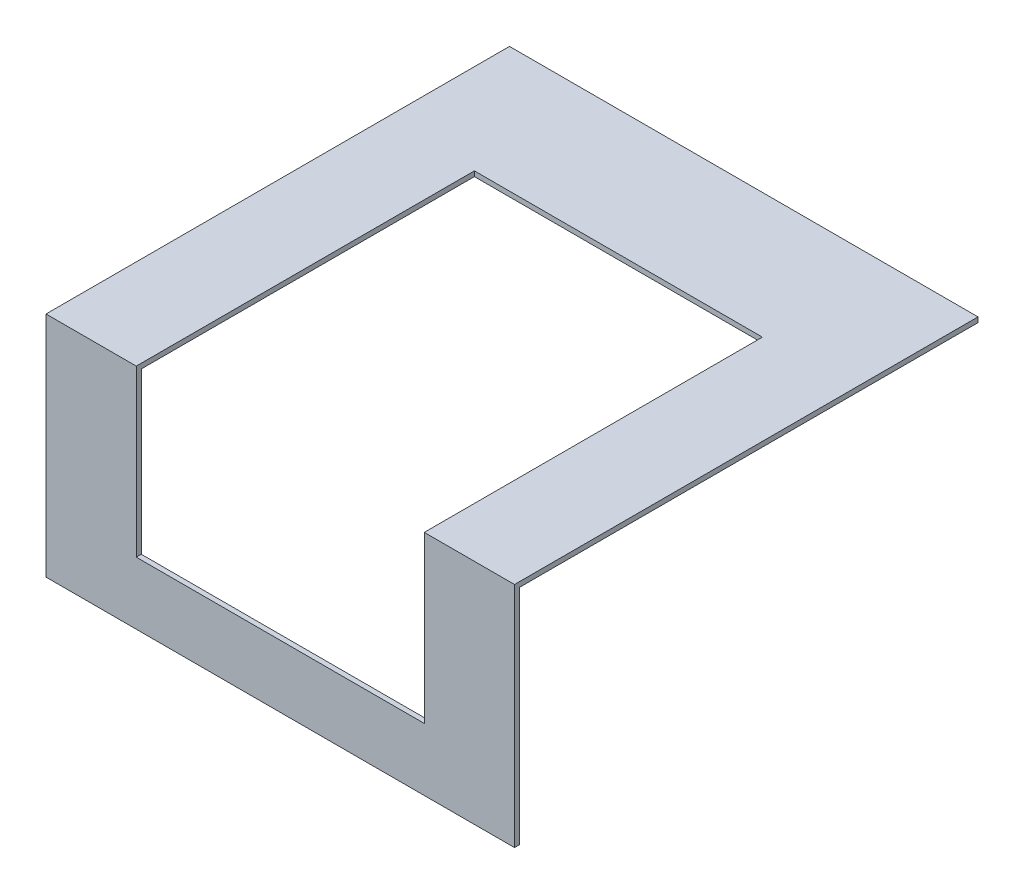
ISO-10303-21;
HEADER;
FILE_DESCRIPTION(('STEP AP214'),'2;1');
FILE_NAME('part.step','',(''),(''),'','','');
FILE_SCHEMA(('AUTOMOTIVE_DESIGN { 1 0 10303 214 1 1 1 1 }'));
ENDSEC;
DATA;
#1=APPLICATION_CONTEXT('core data for automotive mechanical design processes');
#2=APPLICATION_PROTOCOL_DEFINITION('international standard','automotive_design',2000,#1);
#3=PRODUCT_CONTEXT('',#1,'mechanical');
#4=PRODUCT('Part','Part','',(#3));
#5=PRODUCT_RELATED_PRODUCT_CATEGORY('part','',(#4));
#6=PRODUCT_DEFINITION_FORMATION('','',#4);
#7=PRODUCT_DEFINITION_CONTEXT('part definition',#1,'design');
#8=PRODUCT_DEFINITION('design','',#6,#7);
#9=PRODUCT_DEFINITION_SHAPE('','',#8);
#10=(LENGTH_UNIT() NAMED_UNIT(*) SI_UNIT(.MILLI.,.METRE.));
#11=(NAMED_UNIT(*) PLANE_ANGLE_UNIT() SI_UNIT($,.RADIAN.));
#12=(NAMED_UNIT(*) SI_UNIT($,.STERADIAN.) SOLID_ANGLE_UNIT());
#13=UNCERTAINTY_MEASURE_WITH_UNIT(LENGTH_MEASURE(1.E-05),#10,'distance_accuracy_value','');
#14=(GEOMETRIC_REPRESENTATION_CONTEXT(3) GLOBAL_UNCERTAINTY_ASSIGNED_CONTEXT((#13)) GLOBAL_UNIT_ASSIGNED_CONTEXT((#10,
#11,#12)) REPRESENTATION_CONTEXT('',''));
#15=CARTESIAN_POINT('',(0.,0.,0.));
#16=DIRECTION('',(0.,0.,1.));
#17=DIRECTION('',(1.,0.,0.));
#18=AXIS2_PLACEMENT_3D('',#15,#16,#17);
#19=CARTESIAN_POINT('',(233.6,-111.125,5.));
#20=DIRECTION('',(-1.,0.,0.));
#21=DIRECTION('',(0.,0.,1.));
#22=AXIS2_PLACEMENT_3D('',#19,#20,#21);
#23=PLANE('',#22);
#24=DIRECTION('',(0.,1.,0.));
#25=VECTOR('',#24,1.);
#26=CARTESIAN_POINT('',(233.6,-111.125,0.));
#27=LINE('',#26,#25);
#28=CARTESIAN_POINT('',(233.6,-111.125,0.));
#29=VERTEX_POINT('',#28);
#30=CARTESIAN_POINT('',(233.6,111.125,0.));
#31=VERTEX_POINT('',#30);
#32=EDGE_CURVE('E201',#29,#31,#27,.T.);
#33=ORIENTED_EDGE('',*,*,#32,.T.);
#34=DIRECTION('',(0.,0.,-1.));
#35=VECTOR('',#34,1.);
#36=CARTESIAN_POINT('',(233.6,111.125,5.));
#37=LINE('',#36,#35);
#38=CARTESIAN_POINT('',(233.6,111.125,-457.2));
#39=VERTEX_POINT('',#38);
#40=EDGE_CURVE('E176',#31,#39,#37,.T.);
#41=ORIENTED_EDGE('',*,*,#40,.T.);
#42=DIRECTION('',(0.,-1.,0.));
#43=VECTOR('',#42,1.);
#44=CARTESIAN_POINT('',(233.6,116.125,-457.2));
#45=LINE('',#44,#43);
#46=CARTESIAN_POINT('',(233.6,116.125,-457.2));
#47=VERTEX_POINT('',#46);
#48=EDGE_CURVE('E177',#47,#39,#45,.T.);
#49=ORIENTED_EDGE('',*,*,#48,.F.);
#50=DIRECTION('',(0.,0.,-1.));
#51=VECTOR('',#50,1.);
#52=CARTESIAN_POINT('',(233.6,116.125,5.));
#53=LINE('',#52,#51);
#54=CARTESIAN_POINT('',(233.6,116.125,5.));
#55=VERTEX_POINT('',#54);
#56=EDGE_CURVE('E163',#55,#47,#53,.T.);
#57=ORIENTED_EDGE('',*,*,#56,.F.);
#58=DIRECTION('',(0.,1.,0.));
#59=VECTOR('',#58,1.);
#60=CARTESIAN_POINT('',(233.6,-111.125,5.));
#61=LINE('',#60,#59);
#62=CARTESIAN_POINT('',(233.6,-111.125,5.));
#63=VERTEX_POINT('',#62);
#64=EDGE_CURVE('E180',#63,#55,#61,.T.);
#65=ORIENTED_EDGE('',*,*,#64,.F.);
#66=DIRECTION('',(0.,0.,-1.));
#67=VECTOR('',#66,1.);
#68=CARTESIAN_POINT('',(233.6,-111.125,5.));
#69=LINE('',#68,#67);
#70=EDGE_CURVE('E188',#63,#29,#69,.T.);
#71=ORIENTED_EDGE('',*,*,#70,.T.);
#72=EDGE_LOOP('',(#33,#41,#49,#57,#65,#71));
#73=FACE_BOUND('',#72,.T.);
#74=ADVANCED_FACE('F32',(#73),#23,.F.);
#75=CARTESIAN_POINT('',(-233.6,-111.125,5.));
#76=DIRECTION('',(1.,0.,0.));
#77=DIRECTION('',(0.,0.,-1.));
#78=AXIS2_PLACEMENT_3D('',#75,#76,#77);
#79=PLANE('',#78);
#80=DIRECTION('',(0.,-1.,0.));
#81=VECTOR('',#80,1.);
#82=CARTESIAN_POINT('',(-233.6,-111.125,0.));
#83=LINE('',#82,#81);
#84=CARTESIAN_POINT('',(-233.6,111.125,0.));
#85=VERTEX_POINT('',#84);
#86=CARTESIAN_POINT('',(-233.6,-111.125,0.));
#87=VERTEX_POINT('',#86);
#88=EDGE_CURVE('E222',#85,#87,#83,.T.);
#89=ORIENTED_EDGE('',*,*,#88,.T.);
#90=DIRECTION('',(0.,0.,-1.));
#91=VECTOR('',#90,1.);
#92=CARTESIAN_POINT('',(-233.6,-111.125,5.));
#93=LINE('',#92,#91);
#94=CARTESIAN_POINT('',(-233.6,-111.125,5.));
#95=VERTEX_POINT('',#94);
#96=EDGE_CURVE('E205',#95,#87,#93,.T.);
#97=ORIENTED_EDGE('',*,*,#96,.F.);
#98=DIRECTION('',(0.,-1.,0.));
#99=VECTOR('',#98,1.);
#100=CARTESIAN_POINT('',(-233.6,-111.125,5.));
#101=LINE('',#100,#99);
#102=CARTESIAN_POINT('',(-233.6,116.125,5.));
#103=VERTEX_POINT('',#102);
#104=EDGE_CURVE('E183',#103,#95,#101,.T.);
#105=ORIENTED_EDGE('',*,*,#104,.F.);
#106=DIRECTION('',(0.,0.,1.));
#107=VECTOR('',#106,1.);
#108=CARTESIAN_POINT('',(-233.6,116.125,5.));
#109=LINE('',#108,#107);
#110=CARTESIAN_POINT('',(-233.6,116.125,-457.2));
#111=VERTEX_POINT('',#110);
#112=EDGE_CURVE('E158',#111,#103,#109,.T.);
#113=ORIENTED_EDGE('',*,*,#112,.F.);
#114=DIRECTION('',(0.,-1.,0.));
#115=VECTOR('',#114,1.);
#116=CARTESIAN_POINT('',(-233.6,116.125,-457.2));
#117=LINE('',#116,#115);
#118=CARTESIAN_POINT('',(-233.6,111.125,-457.2));
#119=VERTEX_POINT('',#118);
#120=EDGE_CURVE('E167',#111,#119,#117,.T.);
#121=ORIENTED_EDGE('',*,*,#120,.T.);
#122=DIRECTION('',(0.,0.,1.));
#123=VECTOR('',#122,1.);
#124=CARTESIAN_POINT('',(-233.6,111.125,5.));
#125=LINE('',#124,#123);
#126=EDGE_CURVE('E157',#119,#85,#125,.T.);
#127=ORIENTED_EDGE('',*,*,#126,.T.);
#128=EDGE_LOOP('',(#89,#97,#105,#113,#121,#127));
#129=FACE_BOUND('',#128,.T.);
#130=ADVANCED_FACE('F248',(#129),#79,.F.);
#131=CARTESIAN_POINT('',(-233.6,-111.125,5.));
#132=DIRECTION('',(0.,1.,0.));
#133=DIRECTION('',(0.,0.,1.));
#134=AXIS2_PLACEMENT_3D('',#131,#132,#133);
#135=PLANE('',#134);
#136=DIRECTION('',(1.,0.,0.));
#137=VECTOR('',#136,1.);
#138=CARTESIAN_POINT('',(-233.6,-111.125,0.));
#139=LINE('',#138,#137);
#140=EDGE_CURVE('E184',#87,#29,#139,.T.);
#141=ORIENTED_EDGE('',*,*,#140,.T.);
#142=ORIENTED_EDGE('',*,*,#70,.F.);
#143=DIRECTION('',(1.,0.,0.));
#144=VECTOR('',#143,1.);
#145=CARTESIAN_POINT('',(-233.6,-111.125,5.));
#146=LINE('',#145,#144);
#147=EDGE_CURVE('E186',#95,#63,#146,.T.);
#148=ORIENTED_EDGE('',*,*,#147,.F.);
#149=ORIENTED_EDGE('',*,*,#96,.T.);
#150=EDGE_LOOP('',(#141,#142,#148,#149));
#151=FACE_BOUND('',#150,.T.);
#152=ADVANCED_FACE('F250',(#151),#135,.F.);
#153=CARTESIAN_POINT('',(0.,0.,5.));
#154=DIRECTION('',(0.,0.,-1.));
#155=DIRECTION('',(-1.,0.,0.));
#156=AXIS2_PLACEMENT_3D('',#153,#154,#155);
#157=PLANE('',#156);
#158=DIRECTION('',(1.,0.,0.));
#159=VECTOR('',#158,1.);
#160=CARTESIAN_POINT('',(-233.6,116.125,5.));
#161=LINE('',#160,#159);
#162=CARTESIAN_POINT('',(143.6,116.125,5.00000000000012));
#163=VERTEX_POINT('',#162);
#164=EDGE_CURVE('E160',#163,#55,#161,.T.);
#165=ORIENTED_EDGE('',*,*,#164,.F.);
#166=DIRECTION('',(0.,-1.,0.));
#167=VECTOR('',#166,1.);
#168=CARTESIAN_POINT('',(143.6,0.,5.));
#169=LINE('',#168,#167);
#170=CARTESIAN_POINT('',(143.6,-48.8750000000001,5.00000000000012));
#171=VERTEX_POINT('',#170);
#172=EDGE_CURVE('E151',#163,#171,#169,.T.);
#173=ORIENTED_EDGE('',*,*,#172,.T.);
#174=DIRECTION('',(-1.,0.,0.));
#175=VECTOR('',#174,1.);
#176=CARTESIAN_POINT('',(0.,-48.8750000000001,5.));
#177=LINE('',#176,#175);
#178=CARTESIAN_POINT('',(-143.6,-48.8750000000001,5.00000000000012));
#179=VERTEX_POINT('',#178);
#180=EDGE_CURVE('E154',#171,#179,#177,.T.);
#181=ORIENTED_EDGE('',*,*,#180,.T.);
#182=DIRECTION('',(0.,1.,0.));
#183=VECTOR('',#182,1.);
#184=CARTESIAN_POINT('',(-143.6,0.,5.));
#185=LINE('',#184,#183);
#186=CARTESIAN_POINT('',(-143.6,116.125,5.00000000000012));
#187=VERTEX_POINT('',#186);
#188=EDGE_CURVE('E147',#179,#187,#185,.T.);
#189=ORIENTED_EDGE('',*,*,#188,.T.);
#190=EDGE_CURVE('E137',#103,#187,#161,.T.);
#191=ORIENTED_EDGE('',*,*,#190,.F.);
#192=ORIENTED_EDGE('',*,*,#104,.T.);
#193=ORIENTED_EDGE('',*,*,#147,.T.);
#194=ORIENTED_EDGE('',*,*,#64,.T.);
#195=EDGE_LOOP('',(#165,#173,#181,#189,#191,#192,#193,#194));
#196=FACE_BOUND('',#195,.T.);
#197=ADVANCED_FACE('F255',(#196),#157,.F.);
#198=CARTESIAN_POINT('',(0.,0.,0.));
#199=DIRECTION('',(0.,0.,-1.));
#200=DIRECTION('',(-1.,0.,0.));
#201=AXIS2_PLACEMENT_3D('',#198,#199,#200);
#202=PLANE('',#201);
#203=DIRECTION('',(0.,-1.,0.));
#204=VECTOR('',#203,1.);
#205=CARTESIAN_POINT('',(143.6,0.,0.));
#206=LINE('',#205,#204);
#207=CARTESIAN_POINT('',(143.6,111.125,0.));
#208=VERTEX_POINT('',#207);
#209=CARTESIAN_POINT('',(143.6,-48.8750000000001,1.11022302462516E-13));
#210=VERTEX_POINT('',#209);
#211=EDGE_CURVE('E149',#208,#210,#206,.T.);
#212=ORIENTED_EDGE('',*,*,#211,.F.);
#213=DIRECTION('',(-1.,0.,0.));
#214=VECTOR('',#213,1.);
#215=CARTESIAN_POINT('',(-233.6,111.125,0.));
#216=LINE('',#215,#214);
#217=EDGE_CURVE('E194',#31,#208,#216,.T.);
#218=ORIENTED_EDGE('',*,*,#217,.F.);
#219=ORIENTED_EDGE('',*,*,#32,.F.);
#220=ORIENTED_EDGE('',*,*,#140,.F.);
#221=ORIENTED_EDGE('',*,*,#88,.F.);
#222=CARTESIAN_POINT('',(-143.6,111.125,0.));
#223=VERTEX_POINT('',#222);
#224=EDGE_CURVE('E198',#223,#85,#216,.T.);
#225=ORIENTED_EDGE('',*,*,#224,.F.);
#226=DIRECTION('',(0.,1.,0.));
#227=VECTOR('',#226,1.);
#228=CARTESIAN_POINT('',(-143.6,0.,0.));
#229=LINE('',#228,#227);
#230=CARTESIAN_POINT('',(-143.6,-48.8750000000001,1.11022302462516E-13));
#231=VERTEX_POINT('',#230);
#232=EDGE_CURVE('E124',#231,#223,#229,.T.);
#233=ORIENTED_EDGE('',*,*,#232,.F.);
#234=DIRECTION('',(-1.,0.,0.));
#235=VECTOR('',#234,1.);
#236=CARTESIAN_POINT('',(0.,-48.8750000000001,0.));
#237=LINE('',#236,#235);
#238=EDGE_CURVE('E11',#210,#231,#237,.T.);
#239=ORIENTED_EDGE('',*,*,#238,.F.);
#240=EDGE_LOOP('',(#212,#218,#219,#220,#221,#225,#233,#239));
#241=FACE_BOUND('',#240,.T.);
#242=ADVANCED_FACE('F215',(#241),#202,.T.);
#243=CARTESIAN_POINT('',(-233.6,116.125,-457.2));
#244=DIRECTION('',(0.,0.,1.));
#245=DIRECTION('',(1.,0.,0.));
#246=AXIS2_PLACEMENT_3D('',#243,#244,#245);
#247=PLANE('',#246);
#248=DIRECTION('',(-1.,0.,0.));
#249=VECTOR('',#248,1.);
#250=CARTESIAN_POINT('',(-233.6,111.125,-457.2));
#251=LINE('',#250,#249);
#252=EDGE_CURVE('E161',#39,#119,#251,.T.);
#253=ORIENTED_EDGE('',*,*,#252,.T.);
#254=ORIENTED_EDGE('',*,*,#120,.F.);
#255=DIRECTION('',(-1.,0.,0.));
#256=VECTOR('',#255,1.);
#257=CARTESIAN_POINT('',(-233.6,116.125,-457.2));
#258=LINE('',#257,#256);
#259=EDGE_CURVE('E165',#47,#111,#258,.T.);
#260=ORIENTED_EDGE('',*,*,#259,.F.);
#261=ORIENTED_EDGE('',*,*,#48,.T.);
#262=EDGE_LOOP('',(#253,#254,#260,#261));
#263=FACE_BOUND('',#262,.T.);
#264=ADVANCED_FACE('F246',(#263),#247,.F.);
#265=CARTESIAN_POINT('',(0.,116.125,0.));
#266=DIRECTION('',(0.,-1.,0.));
#267=DIRECTION('',(0.,0.,-1.));
#268=AXIS2_PLACEMENT_3D('',#265,#266,#267);
#269=PLANE('',#268);
#270=DIRECTION('',(-1.,0.,0.));
#271=VECTOR('',#270,1.);
#272=CARTESIAN_POINT('',(-143.6,116.125,-332.2));
#273=LINE('',#272,#271);
#274=CARTESIAN_POINT('',(143.6,116.125,-332.2));
#275=VERTEX_POINT('',#274);
#276=CARTESIAN_POINT('',(-143.6,116.125,-332.2));
#277=VERTEX_POINT('',#276);
#278=EDGE_CURVE('E127',#275,#277,#273,.T.);
#279=ORIENTED_EDGE('',*,*,#278,.F.);
#280=DIRECTION('',(0.,0.,-1.));
#281=VECTOR('',#280,1.);
#282=CARTESIAN_POINT('',(143.6,116.125,342.2));
#283=LINE('',#282,#281);
#284=EDGE_CURVE('E131',#163,#275,#283,.T.);
#285=ORIENTED_EDGE('',*,*,#284,.F.);
#286=ORIENTED_EDGE('',*,*,#164,.T.);
#287=ORIENTED_EDGE('',*,*,#56,.T.);
#288=ORIENTED_EDGE('',*,*,#259,.T.);
#289=ORIENTED_EDGE('',*,*,#112,.T.);
#290=ORIENTED_EDGE('',*,*,#190,.T.);
#291=DIRECTION('',(0.,0.,1.));
#292=VECTOR('',#291,1.);
#293=CARTESIAN_POINT('',(-143.6,116.125,342.2));
#294=LINE('',#293,#292);
#295=EDGE_CURVE('E119',#277,#187,#294,.T.);
#296=ORIENTED_EDGE('',*,*,#295,.F.);
#297=EDGE_LOOP('',(#279,#285,#286,#287,#288,#289,#290,#296));
#298=FACE_BOUND('',#297,.T.);
#299=ADVANCED_FACE('F134',(#298),#269,.F.);
#300=CARTESIAN_POINT('',(0.,111.125,0.));
#301=DIRECTION('',(0.,-1.,0.));
#302=DIRECTION('',(0.,0.,-1.));
#303=AXIS2_PLACEMENT_3D('',#300,#301,#302);
#304=PLANE('',#303);
#305=DIRECTION('',(0.,0.,1.));
#306=VECTOR('',#305,1.);
#307=CARTESIAN_POINT('',(143.6,111.125,0.));
#308=LINE('',#307,#306);
#309=CARTESIAN_POINT('',(143.6,111.125,-332.2));
#310=VERTEX_POINT('',#309);
#311=EDGE_CURVE('E39',#310,#208,#308,.T.);
#312=ORIENTED_EDGE('',*,*,#311,.F.);
#313=DIRECTION('',(1.,0.,0.));
#314=VECTOR('',#313,1.);
#315=CARTESIAN_POINT('',(0.,111.125,-332.2));
#316=LINE('',#315,#314);
#317=CARTESIAN_POINT('',(-143.6,111.125,-332.2));
#318=VERTEX_POINT('',#317);
#319=EDGE_CURVE('E203',#318,#310,#316,.T.);
#320=ORIENTED_EDGE('',*,*,#319,.F.);
#321=DIRECTION('',(0.,0.,-1.));
#322=VECTOR('',#321,1.);
#323=CARTESIAN_POINT('',(-143.6,111.125,0.));
#324=LINE('',#323,#322);
#325=EDGE_CURVE('E122',#223,#318,#324,.T.);
#326=ORIENTED_EDGE('',*,*,#325,.F.);
#327=ORIENTED_EDGE('',*,*,#224,.T.);
#328=ORIENTED_EDGE('',*,*,#126,.F.);
#329=ORIENTED_EDGE('',*,*,#252,.F.);
#330=ORIENTED_EDGE('',*,*,#40,.F.);
#331=ORIENTED_EDGE('',*,*,#217,.T.);
#332=EDGE_LOOP('',(#312,#320,#326,#327,#328,#329,#330,#331));
#333=FACE_BOUND('',#332,.T.);
#334=ADVANCED_FACE('F220',(#333),#304,.T.);
#335=CARTESIAN_POINT('',(0.,-48.8750000000001,0.));
#336=DIRECTION('',(0.,-1.,0.));
#337=DIRECTION('',(0.,0.,-1.));
#338=AXIS2_PLACEMENT_3D('',#335,#336,#337);
#339=PLANE('',#338);
#340=DIRECTION('',(0.,0.,-1.));
#341=VECTOR('',#340,1.);
#342=CARTESIAN_POINT('',(143.6,-48.8750000000001,342.2));
#343=LINE('',#342,#341);
#344=EDGE_CURVE('E138',#171,#210,#343,.T.);
#345=ORIENTED_EDGE('',*,*,#344,.T.);
#346=ORIENTED_EDGE('',*,*,#238,.T.);
#347=DIRECTION('',(0.,0.,1.));
#348=VECTOR('',#347,1.);
#349=CARTESIAN_POINT('',(-143.6,-48.8750000000001,342.2));
#350=LINE('',#349,#348);
#351=EDGE_CURVE('E141',#231,#179,#350,.T.);
#352=ORIENTED_EDGE('',*,*,#351,.T.);
#353=ORIENTED_EDGE('',*,*,#180,.F.);
#354=EDGE_LOOP('',(#345,#346,#352,#353));
#355=FACE_BOUND('',#354,.T.);
#356=ADVANCED_FACE('F267',(#355),#339,.F.);
#357=CARTESIAN_POINT('',(143.6,-48.8750000000001,342.2));
#358=DIRECTION('',(1.,0.,0.));
#359=DIRECTION('',(0.,0.,-1.));
#360=AXIS2_PLACEMENT_3D('',#357,#358,#359);
#361=PLANE('',#360);
#362=ORIENTED_EDGE('',*,*,#284,.T.);
#363=DIRECTION('',(0.,1.,0.));
#364=VECTOR('',#363,1.);
#365=CARTESIAN_POINT('',(143.6,-48.8750000000001,-332.2));
#366=LINE('',#365,#364);
#367=EDGE_CURVE('E46',#310,#275,#366,.T.);
#368=ORIENTED_EDGE('',*,*,#367,.F.);
#369=ORIENTED_EDGE('',*,*,#311,.T.);
#370=ORIENTED_EDGE('',*,*,#211,.T.);
#371=ORIENTED_EDGE('',*,*,#344,.F.);
#372=ORIENTED_EDGE('',*,*,#172,.F.);
#373=EDGE_LOOP('',(#362,#368,#369,#370,#371,#372));
#374=FACE_BOUND('',#373,.T.);
#375=ADVANCED_FACE('F209',(#374),#361,.F.);
#376=CARTESIAN_POINT('',(-143.6,-48.8750000000001,342.2));
#377=DIRECTION('',(-1.,0.,0.));
#378=DIRECTION('',(0.,0.,1.));
#379=AXIS2_PLACEMENT_3D('',#376,#377,#378);
#380=PLANE('',#379);
#381=ORIENTED_EDGE('',*,*,#351,.F.);
#382=ORIENTED_EDGE('',*,*,#232,.T.);
#383=ORIENTED_EDGE('',*,*,#325,.T.);
#384=DIRECTION('',(0.,1.,0.));
#385=VECTOR('',#384,1.);
#386=CARTESIAN_POINT('',(-143.6,-48.8750000000001,-332.2));
#387=LINE('',#386,#385);
#388=EDGE_CURVE('E51',#318,#277,#387,.T.);
#389=ORIENTED_EDGE('',*,*,#388,.T.);
#390=ORIENTED_EDGE('',*,*,#295,.T.);
#391=ORIENTED_EDGE('',*,*,#188,.F.);
#392=EDGE_LOOP('',(#381,#382,#383,#389,#390,#391));
#393=FACE_BOUND('',#392,.T.);
#394=ADVANCED_FACE('F117',(#393),#380,.F.);
#395=CARTESIAN_POINT('',(-143.6,-48.8750000000001,-332.2));
#396=DIRECTION('',(0.,0.,-1.));
#397=DIRECTION('',(-1.,0.,0.));
#398=AXIS2_PLACEMENT_3D('',#395,#396,#397);
#399=PLANE('',#398);
#400=ORIENTED_EDGE('',*,*,#319,.T.);
#401=ORIENTED_EDGE('',*,*,#367,.T.);
#402=ORIENTED_EDGE('',*,*,#278,.T.);
#403=ORIENTED_EDGE('',*,*,#388,.F.);
#404=EDGE_LOOP('',(#400,#401,#402,#403));
#405=FACE_BOUND('',#404,.T.);
#406=ADVANCED_FACE('F128',(#405),#399,.F.);
#407=CLOSED_SHELL('',(#74,#130,#152,#197,#242,#264,#299,#334,#356,#375,#394,#406));
#408=MANIFOLD_SOLID_BREP('B2',#407);
#409=ADVANCED_BREP_SHAPE_REPRESENTATION('',(#18,#408),#14);
#410=SHAPE_DEFINITION_REPRESENTATION(#9,#409);
ENDSEC;
END-ISO-10303-21;
